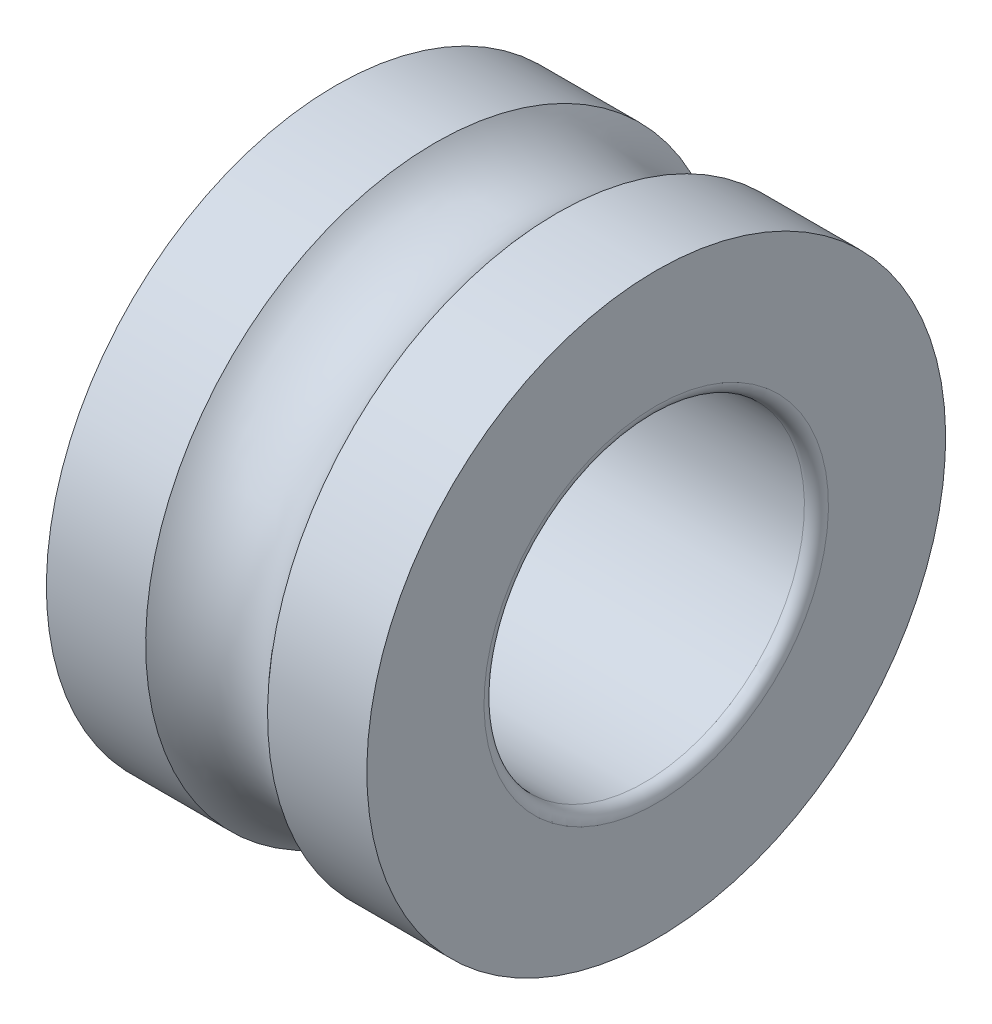
ISO-10303-21;
HEADER;
FILE_DESCRIPTION(('STEP AP214'),'2;1');
FILE_NAME('part.step','',(''),(''),'','','');
FILE_SCHEMA(('AUTOMOTIVE_DESIGN { 1 0 10303 214 1 1 1 1 }'));
ENDSEC;
DATA;
#1=APPLICATION_CONTEXT('core data for automotive mechanical design processes');
#2=APPLICATION_PROTOCOL_DEFINITION('international standard','automotive_design',2000,#1);
#3=PRODUCT_CONTEXT('',#1,'mechanical');
#4=PRODUCT('Part','Part','',(#3));
#5=PRODUCT_RELATED_PRODUCT_CATEGORY('part','',(#4));
#6=PRODUCT_DEFINITION_FORMATION('','',#4);
#7=PRODUCT_DEFINITION_CONTEXT('part definition',#1,'design');
#8=PRODUCT_DEFINITION('design','',#6,#7);
#9=PRODUCT_DEFINITION_SHAPE('','',#8);
#10=(LENGTH_UNIT() NAMED_UNIT(*) SI_UNIT(.MILLI.,.METRE.));
#11=(NAMED_UNIT(*) PLANE_ANGLE_UNIT() SI_UNIT($,.RADIAN.));
#12=(NAMED_UNIT(*) SI_UNIT($,.STERADIAN.) SOLID_ANGLE_UNIT());
#13=UNCERTAINTY_MEASURE_WITH_UNIT(LENGTH_MEASURE(1.E-05),#10,'distance_accuracy_value','');
#14=(GEOMETRIC_REPRESENTATION_CONTEXT(3) GLOBAL_UNCERTAINTY_ASSIGNED_CONTEXT((#13)) GLOBAL_UNIT_ASSIGNED_CONTEXT((#10,
#11,#12)) REPRESENTATION_CONTEXT('',''));
#15=CARTESIAN_POINT('',(0.,0.,0.));
#16=DIRECTION('',(0.,0.,1.));
#17=DIRECTION('',(1.,0.,0.));
#18=AXIS2_PLACEMENT_3D('',#15,#16,#17);
#19=CARTESIAN_POINT('',(6.7603642630345,0.,0.));
#20=DIRECTION('',(-1.,0.,0.));
#21=DIRECTION('',(0.,1.,0.));
#22=AXIS2_PLACEMENT_3D('',#19,#20,#21);
#23=CYLINDRICAL_SURFACE('',#22,7.225);
#24=CARTESIAN_POINT('',(5.520728526069,0.,0.));
#25=DIRECTION('',(1.,0.,0.));
#26=DIRECTION('',(0.,1.,0.));
#27=AXIS2_PLACEMENT_3D('',#24,#25,#26);
#28=CIRCLE('',#27,7.225);
#29=CARTESIAN_POINT('',(5.520728526069,7.225,0.));
#30=VERTEX_POINT('',#29);
#31=EDGE_CURVE('E11',#30,#30,#28,.T.);
#32=ORIENTED_EDGE('',*,*,#31,.T.);
#33=EDGE_LOOP('',(#32));
#34=FACE_BOUND('',#33,.T.);
#35=CARTESIAN_POINT('',(8.,0.,0.));
#36=DIRECTION('',(1.,0.,0.));
#37=DIRECTION('',(0.,1.,0.));
#38=AXIS2_PLACEMENT_3D('',#35,#36,#37);
#39=CIRCLE('',#38,7.225);
#40=CARTESIAN_POINT('',(8.,7.225,0.));
#41=VERTEX_POINT('',#40);
#42=EDGE_CURVE('E63',#41,#41,#39,.T.);
#43=ORIENTED_EDGE('',*,*,#42,.F.);
#44=EDGE_LOOP('',(#43));
#45=FACE_BOUND('',#44,.T.);
#46=ADVANCED_FACE('F16',(#34,#45),#23,.T.);
#47=CARTESIAN_POINT('',(4.,0.,0.));
#48=DIRECTION('',(1.,0.,0.));
#49=DIRECTION('',(0.,0.,-1.));
#50=AXIS2_PLACEMENT_3D('',#47,#48,#49);
#51=TOROIDAL_SURFACE('',#50,8.5,1.9845);
#52=CARTESIAN_POINT('',(2.479271473931,0.,0.));
#53=DIRECTION('',(1.,0.,0.));
#54=DIRECTION('',(0.,1.,0.));
#55=AXIS2_PLACEMENT_3D('',#52,#53,#54);
#56=CIRCLE('',#55,7.225);
#57=CARTESIAN_POINT('',(2.479271473931,7.225,0.));
#58=VERTEX_POINT('',#57);
#59=EDGE_CURVE('E27',#58,#58,#56,.T.);
#60=ORIENTED_EDGE('',*,*,#59,.T.);
#61=EDGE_LOOP('',(#60));
#62=FACE_BOUND('',#61,.T.);
#63=ORIENTED_EDGE('',*,*,#31,.F.);
#64=EDGE_LOOP('',(#63));
#65=FACE_BOUND('',#64,.T.);
#66=ADVANCED_FACE('F91',(#62,#65),#51,.F.);
#67=CARTESIAN_POINT('',(1.2396357369655,0.,0.));
#68=DIRECTION('',(-1.,0.,0.));
#69=DIRECTION('',(0.,1.,0.));
#70=AXIS2_PLACEMENT_3D('',#67,#68,#69);
#71=CYLINDRICAL_SURFACE('',#70,7.225);
#72=CARTESIAN_POINT('',(0.,0.,0.));
#73=DIRECTION('',(1.,0.,0.));
#74=DIRECTION('',(0.,1.,0.));
#75=AXIS2_PLACEMENT_3D('',#72,#73,#74);
#76=CIRCLE('',#75,7.225);
#77=CARTESIAN_POINT('',(0.,7.225,0.));
#78=VERTEX_POINT('',#77);
#79=EDGE_CURVE('E60',#78,#78,#76,.T.);
#80=ORIENTED_EDGE('',*,*,#79,.T.);
#81=EDGE_LOOP('',(#80));
#82=FACE_BOUND('',#81,.T.);
#83=ORIENTED_EDGE('',*,*,#59,.F.);
#84=EDGE_LOOP('',(#83));
#85=FACE_BOUND('',#84,.T.);
#86=ADVANCED_FACE('F95',(#82,#85),#71,.T.);
#87=CARTESIAN_POINT('',(0.,5.7625,0.));
#88=DIRECTION('',(-1.,0.,0.));
#89=DIRECTION('',(0.,-1.,0.));
#90=AXIS2_PLACEMENT_3D('',#87,#88,#89);
#91=PLANE('',#90);
#92=CARTESIAN_POINT('',(0.,0.,0.));
#93=DIRECTION('',(1.,0.,0.));
#94=DIRECTION('',(0.,1.,0.));
#95=AXIS2_PLACEMENT_3D('',#92,#93,#94);
#96=CIRCLE('',#95,4.3);
#97=CARTESIAN_POINT('',(0.,4.3,0.));
#98=VERTEX_POINT('',#97);
#99=EDGE_CURVE('E55',#98,#98,#96,.T.);
#100=ORIENTED_EDGE('',*,*,#99,.T.);
#101=EDGE_LOOP('',(#100));
#102=FACE_BOUND('',#101,.T.);
#103=ORIENTED_EDGE('',*,*,#79,.F.);
#104=EDGE_LOOP('',(#103));
#105=FACE_BOUND('',#104,.T.);
#106=ADVANCED_FACE('F18',(#102,#105),#91,.T.);
#107=CARTESIAN_POINT('',(0.3,0.,0.));
#108=DIRECTION('',(1.,0.,0.));
#109=DIRECTION('',(0.,0.,-1.));
#110=AXIS2_PLACEMENT_3D('',#107,#108,#109);
#111=TOROIDAL_SURFACE('',#110,4.3,0.3);
#112=CARTESIAN_POINT('',(0.3,0.,0.));
#113=DIRECTION('',(1.,0.,0.));
#114=DIRECTION('',(0.,1.,0.));
#115=AXIS2_PLACEMENT_3D('',#112,#113,#114);
#116=CIRCLE('',#115,4.);
#117=CARTESIAN_POINT('',(0.3,4.,0.));
#118=VERTEX_POINT('',#117);
#119=EDGE_CURVE('E20',#118,#118,#116,.T.);
#120=ORIENTED_EDGE('',*,*,#119,.T.);
#121=EDGE_LOOP('',(#120));
#122=FACE_BOUND('',#121,.T.);
#123=ORIENTED_EDGE('',*,*,#99,.F.);
#124=EDGE_LOOP('',(#123));
#125=FACE_BOUND('',#124,.T.);
#126=ADVANCED_FACE('F51',(#122,#125),#111,.T.);
#127=CARTESIAN_POINT('',(4.,0.,0.));
#128=DIRECTION('',(-1.,0.,0.));
#129=DIRECTION('',(0.,1.,0.));
#130=AXIS2_PLACEMENT_3D('',#127,#128,#129);
#131=CYLINDRICAL_SURFACE('',#130,4.);
#132=CARTESIAN_POINT('',(7.7,0.,0.));
#133=DIRECTION('',(1.,0.,0.));
#134=DIRECTION('',(0.,1.,0.));
#135=AXIS2_PLACEMENT_3D('',#132,#133,#134);
#136=CIRCLE('',#135,4.);
#137=CARTESIAN_POINT('',(7.7,4.,0.));
#138=VERTEX_POINT('',#137);
#139=EDGE_CURVE('E56',#138,#138,#136,.T.);
#140=ORIENTED_EDGE('',*,*,#139,.T.);
#141=EDGE_LOOP('',(#140));
#142=FACE_BOUND('',#141,.T.);
#143=ORIENTED_EDGE('',*,*,#119,.F.);
#144=EDGE_LOOP('',(#143));
#145=FACE_BOUND('',#144,.T.);
#146=ADVANCED_FACE('F87',(#142,#145),#131,.F.);
#147=CARTESIAN_POINT('',(7.7,0.,0.));
#148=DIRECTION('',(1.,0.,0.));
#149=DIRECTION('',(0.,0.,-1.));
#150=AXIS2_PLACEMENT_3D('',#147,#148,#149);
#151=TOROIDAL_SURFACE('',#150,4.3,0.3);
#152=CARTESIAN_POINT('',(8.,0.,0.));
#153=DIRECTION('',(1.,0.,0.));
#154=DIRECTION('',(0.,1.,0.));
#155=AXIS2_PLACEMENT_3D('',#152,#153,#154);
#156=CIRCLE('',#155,4.3);
#157=CARTESIAN_POINT('',(8.,4.3,0.));
#158=VERTEX_POINT('',#157);
#159=EDGE_CURVE('E69',#158,#158,#156,.T.);
#160=ORIENTED_EDGE('',*,*,#159,.T.);
#161=EDGE_LOOP('',(#160));
#162=FACE_BOUND('',#161,.T.);
#163=ORIENTED_EDGE('',*,*,#139,.F.);
#164=EDGE_LOOP('',(#163));
#165=FACE_BOUND('',#164,.T.);
#166=ADVANCED_FACE('F76',(#162,#165),#151,.T.);
#167=CARTESIAN_POINT('',(8.,5.7625,0.));
#168=DIRECTION('',(1.,0.,0.));
#169=DIRECTION('',(0.,1.,0.));
#170=AXIS2_PLACEMENT_3D('',#167,#168,#169);
#171=PLANE('',#170);
#172=ORIENTED_EDGE('',*,*,#42,.T.);
#173=EDGE_LOOP('',(#172));
#174=FACE_BOUND('',#173,.T.);
#175=ORIENTED_EDGE('',*,*,#159,.F.);
#176=EDGE_LOOP('',(#175));
#177=FACE_BOUND('',#176,.T.);
#178=ADVANCED_FACE('F79',(#174,#177),#171,.T.);
#179=CLOSED_SHELL('',(#46,#66,#86,#106,#126,#146,#166,#178));
#180=MANIFOLD_SOLID_BREP('B1',#179);
#181=ADVANCED_BREP_SHAPE_REPRESENTATION('',(#18,#180),#14);
#182=SHAPE_DEFINITION_REPRESENTATION(#9,#181);
ENDSEC;
END-ISO-10303-21;
